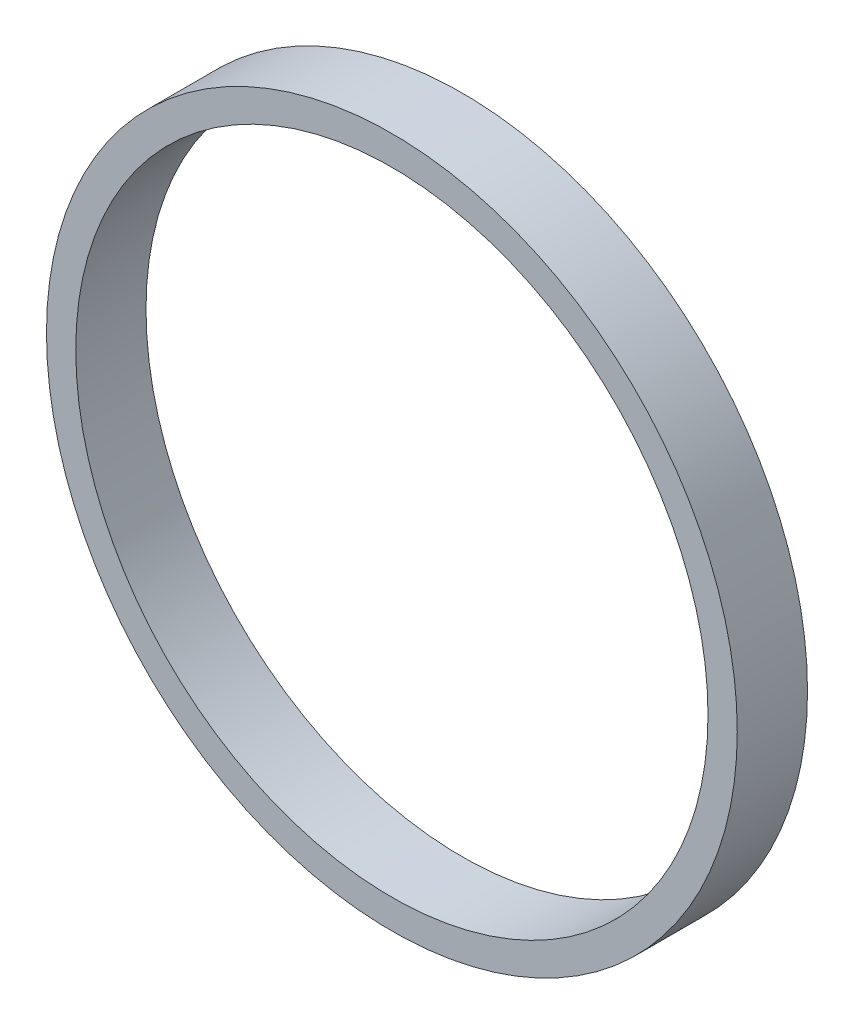
ISO-10303-21;
HEADER;
FILE_DESCRIPTION(('STEP AP214'),'2;1');
FILE_NAME('part.step','',(''),(''),'','','');
FILE_SCHEMA(('AUTOMOTIVE_DESIGN { 1 0 10303 214 1 1 1 1 }'));
ENDSEC;
DATA;
#1=APPLICATION_CONTEXT('core data for automotive mechanical design processes');
#2=APPLICATION_PROTOCOL_DEFINITION('international standard','automotive_design',2000,#1);
#3=PRODUCT_CONTEXT('',#1,'mechanical');
#4=PRODUCT('Part','Part','',(#3));
#5=PRODUCT_RELATED_PRODUCT_CATEGORY('part','',(#4));
#6=PRODUCT_DEFINITION_FORMATION('','',#4);
#7=PRODUCT_DEFINITION_CONTEXT('part definition',#1,'design');
#8=PRODUCT_DEFINITION('design','',#6,#7);
#9=PRODUCT_DEFINITION_SHAPE('','',#8);
#10=(LENGTH_UNIT() NAMED_UNIT(*) SI_UNIT(.MILLI.,.METRE.));
#11=(NAMED_UNIT(*) PLANE_ANGLE_UNIT() SI_UNIT($,.RADIAN.));
#12=(NAMED_UNIT(*) SI_UNIT($,.STERADIAN.) SOLID_ANGLE_UNIT());
#13=UNCERTAINTY_MEASURE_WITH_UNIT(LENGTH_MEASURE(1.E-05),#10,'distance_accuracy_value','');
#14=(GEOMETRIC_REPRESENTATION_CONTEXT(3) GLOBAL_UNCERTAINTY_ASSIGNED_CONTEXT((#13)) GLOBAL_UNIT_ASSIGNED_CONTEXT((#10,
#11,#12)) REPRESENTATION_CONTEXT('',''));
#15=CARTESIAN_POINT('',(0.,0.,0.));
#16=DIRECTION('',(0.,0.,1.));
#17=DIRECTION('',(1.,0.,0.));
#18=AXIS2_PLACEMENT_3D('',#15,#16,#17);
#19=CARTESIAN_POINT('',(0.,0.,12.));
#20=DIRECTION('',(0.,0.,1.));
#21=DIRECTION('',(1.,0.,0.));
#22=AXIS2_PLACEMENT_3D('',#19,#20,#21);
#23=PLANE('',#22);
#24=CARTESIAN_POINT('',(0.,0.,12.));
#25=DIRECTION('',(0.,0.,1.));
#26=DIRECTION('',(1.,0.,0.));
#27=AXIS2_PLACEMENT_3D('',#24,#25,#26);
#28=CIRCLE('',#27,59.);
#29=CARTESIAN_POINT('',(59.,0.,12.));
#30=VERTEX_POINT('',#29);
#31=EDGE_CURVE('E10',#30,#30,#28,.T.);
#32=ORIENTED_EDGE('',*,*,#31,.T.);
#33=EDGE_LOOP('',(#32));
#34=FACE_BOUND('',#33,.T.);
#35=CARTESIAN_POINT('',(0.,0.,12.));
#36=DIRECTION('',(0.,0.,1.));
#37=DIRECTION('',(1.,0.,0.));
#38=AXIS2_PLACEMENT_3D('',#35,#36,#37);
#39=CIRCLE('',#38,54.);
#40=CARTESIAN_POINT('',(54.,0.,12.));
#41=VERTEX_POINT('',#40);
#42=EDGE_CURVE('E43',#41,#41,#39,.T.);
#43=ORIENTED_EDGE('',*,*,#42,.F.);
#44=EDGE_LOOP('',(#43));
#45=FACE_BOUND('',#44,.T.);
#46=ADVANCED_FACE('F32',(#34,#45),#23,.T.);
#47=CARTESIAN_POINT('',(0.,0.,0.));
#48=DIRECTION('',(0.,0.,1.));
#49=DIRECTION('',(1.,0.,0.));
#50=AXIS2_PLACEMENT_3D('',#47,#48,#49);
#51=PLANE('',#50);
#52=CARTESIAN_POINT('',(0.,0.,0.));
#53=DIRECTION('',(0.,0.,1.));
#54=DIRECTION('',(1.,0.,0.));
#55=AXIS2_PLACEMENT_3D('',#52,#53,#54);
#56=CIRCLE('',#55,59.);
#57=CARTESIAN_POINT('',(59.,0.,0.));
#58=VERTEX_POINT('',#57);
#59=EDGE_CURVE('E36',#58,#58,#56,.T.);
#60=ORIENTED_EDGE('',*,*,#59,.F.);
#61=EDGE_LOOP('',(#60));
#62=FACE_BOUND('',#61,.T.);
#63=CARTESIAN_POINT('',(0.,0.,0.));
#64=DIRECTION('',(0.,0.,1.));
#65=DIRECTION('',(1.,0.,0.));
#66=AXIS2_PLACEMENT_3D('',#63,#64,#65);
#67=CIRCLE('',#66,54.);
#68=CARTESIAN_POINT('',(54.,0.,0.));
#69=VERTEX_POINT('',#68);
#70=EDGE_CURVE('E45',#69,#69,#67,.T.);
#71=ORIENTED_EDGE('',*,*,#70,.T.);
#72=EDGE_LOOP('',(#71));
#73=FACE_BOUND('',#72,.T.);
#74=ADVANCED_FACE('F55',(#62,#73),#51,.F.);
#75=CARTESIAN_POINT('',(0.,0.,12.));
#76=DIRECTION('',(0.,0.,-1.));
#77=DIRECTION('',(-1.,0.,0.));
#78=AXIS2_PLACEMENT_3D('',#75,#76,#77);
#79=CYLINDRICAL_SURFACE('',#78,59.);
#80=ORIENTED_EDGE('',*,*,#31,.F.);
#81=EDGE_LOOP('',(#80));
#82=FACE_BOUND('',#81,.T.);
#83=ORIENTED_EDGE('',*,*,#59,.T.);
#84=EDGE_LOOP('',(#83));
#85=FACE_BOUND('',#84,.T.);
#86=ADVANCED_FACE('F34',(#82,#85),#79,.T.);
#87=CARTESIAN_POINT('',(0.,0.,12.));
#88=DIRECTION('',(0.,0.,-1.));
#89=DIRECTION('',(-1.,0.,0.));
#90=AXIS2_PLACEMENT_3D('',#87,#88,#89);
#91=CYLINDRICAL_SURFACE('',#90,54.);
#92=ORIENTED_EDGE('',*,*,#42,.T.);
#93=EDGE_LOOP('',(#92));
#94=FACE_BOUND('',#93,.T.);
#95=ORIENTED_EDGE('',*,*,#70,.F.);
#96=EDGE_LOOP('',(#95));
#97=FACE_BOUND('',#96,.T.);
#98=ADVANCED_FACE('F51',(#94,#97),#91,.F.);
#99=CLOSED_SHELL('',(#46,#74,#86,#98));
#100=MANIFOLD_SOLID_BREP('B2',#99);
#101=ADVANCED_BREP_SHAPE_REPRESENTATION('',(#18,#100),#14);
#102=SHAPE_DEFINITION_REPRESENTATION(#9,#101);
ENDSEC;
END-ISO-10303-21;
